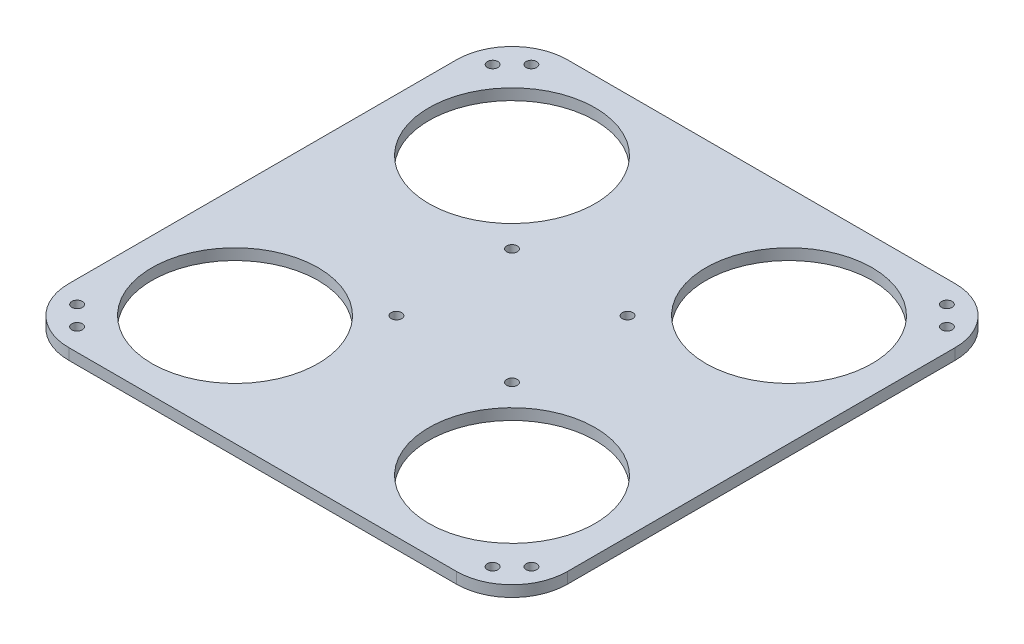
ISO-10303-21;
HEADER;
FILE_DESCRIPTION(('STEP AP214'),'2;1');
FILE_NAME('part.step','',(''),(''),'','','');
FILE_SCHEMA(('AUTOMOTIVE_DESIGN { 1 0 10303 214 1 1 1 1 }'));
ENDSEC;
DATA;
#1=APPLICATION_CONTEXT('core data for automotive mechanical design processes');
#2=APPLICATION_PROTOCOL_DEFINITION('international standard','automotive_design',2000,#1);
#3=PRODUCT_CONTEXT('',#1,'mechanical');
#4=PRODUCT('Part','Part','',(#3));
#5=PRODUCT_RELATED_PRODUCT_CATEGORY('part','',(#4));
#6=PRODUCT_DEFINITION_FORMATION('','',#4);
#7=PRODUCT_DEFINITION_CONTEXT('part definition',#1,'design');
#8=PRODUCT_DEFINITION('design','',#6,#7);
#9=PRODUCT_DEFINITION_SHAPE('','',#8);
#10=(LENGTH_UNIT() NAMED_UNIT(*) SI_UNIT(.MILLI.,.METRE.));
#11=(NAMED_UNIT(*) PLANE_ANGLE_UNIT() SI_UNIT($,.RADIAN.));
#12=(NAMED_UNIT(*) SI_UNIT($,.STERADIAN.) SOLID_ANGLE_UNIT());
#13=UNCERTAINTY_MEASURE_WITH_UNIT(LENGTH_MEASURE(1.E-05),#10,'distance_accuracy_value','');
#14=(GEOMETRIC_REPRESENTATION_CONTEXT(3) GLOBAL_UNCERTAINTY_ASSIGNED_CONTEXT((#13)) GLOBAL_UNIT_ASSIGNED_CONTEXT((#10,
#11,#12)) REPRESENTATION_CONTEXT('',''));
#15=CARTESIAN_POINT('',(0.,0.,0.));
#16=DIRECTION('',(0.,0.,1.));
#17=DIRECTION('',(1.,0.,0.));
#18=AXIS2_PLACEMENT_3D('',#15,#16,#17);
#19=CARTESIAN_POINT('',(0.,4.,0.));
#20=DIRECTION('',(0.,-1.,0.));
#21=DIRECTION('',(0.,0.,-1.));
#22=AXIS2_PLACEMENT_3D('',#19,#20,#21);
#23=PLANE('',#22);
#24=DIRECTION('',(0.,0.,1.));
#25=VECTOR('',#24,1.);
#26=CARTESIAN_POINT('',(-90.,4.,90.));
#27=LINE('',#26,#25);
#28=CARTESIAN_POINT('',(-90.,4.,-69.9999999999999));
#29=VERTEX_POINT('',#28);
#30=CARTESIAN_POINT('',(-90.,4.,70.));
#31=VERTEX_POINT('',#30);
#32=EDGE_CURVE('E200',#29,#31,#27,.T.);
#33=ORIENTED_EDGE('',*,*,#32,.T.);
#34=CARTESIAN_POINT('',(-70.,4.,70.));
#35=DIRECTION('',(0.,-1.,0.));
#36=DIRECTION('',(0.,0.,-1.));
#37=AXIS2_PLACEMENT_3D('',#34,#35,#36);
#38=CIRCLE('',#37,20.);
#39=CARTESIAN_POINT('',(-70.,4.,90.));
#40=VERTEX_POINT('',#39);
#41=EDGE_CURVE('E169',#31,#40,#38,.F.);
#42=ORIENTED_EDGE('',*,*,#41,.T.);
#43=DIRECTION('',(1.,0.,0.));
#44=VECTOR('',#43,1.);
#45=CARTESIAN_POINT('',(-90.,4.,90.));
#46=LINE('',#45,#44);
#47=CARTESIAN_POINT('',(69.9999999999999,4.,90.));
#48=VERTEX_POINT('',#47);
#49=EDGE_CURVE('E127',#40,#48,#46,.T.);
#50=ORIENTED_EDGE('',*,*,#49,.T.);
#51=CARTESIAN_POINT('',(70.,4.,70.));
#52=DIRECTION('',(0.,-1.,0.));
#53=DIRECTION('',(0.,0.,-1.));
#54=AXIS2_PLACEMENT_3D('',#51,#52,#53);
#55=CIRCLE('',#54,20.);
#56=CARTESIAN_POINT('',(90.,4.,70.));
#57=VERTEX_POINT('',#56);
#58=EDGE_CURVE('E161',#48,#57,#55,.F.);
#59=ORIENTED_EDGE('',*,*,#58,.T.);
#60=DIRECTION('',(0.,0.,-1.));
#61=VECTOR('',#60,1.);
#62=CARTESIAN_POINT('',(90.,4.,90.));
#63=LINE('',#62,#61);
#64=CARTESIAN_POINT('',(90.,4.,-69.9999999999999));
#65=VERTEX_POINT('',#64);
#66=EDGE_CURVE('E136',#57,#65,#63,.T.);
#67=ORIENTED_EDGE('',*,*,#66,.T.);
#68=CARTESIAN_POINT('',(70.,4.,-70.));
#69=DIRECTION('',(0.,-1.,0.));
#70=DIRECTION('',(0.,0.,-1.));
#71=AXIS2_PLACEMENT_3D('',#68,#69,#70);
#72=CIRCLE('',#71,20.);
#73=CARTESIAN_POINT('',(69.9999999999999,4.,-90.));
#74=VERTEX_POINT('',#73);
#75=EDGE_CURVE('E62',#65,#74,#72,.F.);
#76=ORIENTED_EDGE('',*,*,#75,.T.);
#77=DIRECTION('',(-1.,0.,0.));
#78=VECTOR('',#77,1.);
#79=CARTESIAN_POINT('',(-90.,4.,-90.));
#80=LINE('',#79,#78);
#81=CARTESIAN_POINT('',(-70.,4.,-90.));
#82=VERTEX_POINT('',#81);
#83=EDGE_CURVE('E141',#74,#82,#80,.T.);
#84=ORIENTED_EDGE('',*,*,#83,.T.);
#85=CARTESIAN_POINT('',(-70.,4.,-70.));
#86=DIRECTION('',(0.,-1.,0.));
#87=DIRECTION('',(0.,0.,-1.));
#88=AXIS2_PLACEMENT_3D('',#85,#86,#87);
#89=CIRCLE('',#88,20.);
#90=EDGE_CURVE('E166',#82,#29,#89,.F.);
#91=ORIENTED_EDGE('',*,*,#90,.T.);
#92=EDGE_LOOP('',(#33,#42,#50,#59,#67,#76,#84,#91));
#93=FACE_BOUND('',#92,.T.);
#94=CARTESIAN_POINT('',(-75.,4.,-82.));
#95=DIRECTION('',(0.,1.,0.));
#96=DIRECTION('',(0.,0.,1.));
#97=AXIS2_PLACEMENT_3D('',#94,#95,#96);
#98=CIRCLE('',#97,1.9);
#99=CARTESIAN_POINT('',(-75.,4.,-80.1));
#100=VERTEX_POINT('',#99);
#101=EDGE_CURVE('E190',#100,#100,#98,.T.);
#102=ORIENTED_EDGE('',*,*,#101,.F.);
#103=EDGE_LOOP('',(#102));
#104=FACE_BOUND('',#103,.T.);
#105=CARTESIAN_POINT('',(-82.,4.,-75.));
#106=DIRECTION('',(0.,1.,0.));
#107=DIRECTION('',(0.,0.,1.));
#108=AXIS2_PLACEMENT_3D('',#105,#106,#107);
#109=CIRCLE('',#108,1.9);
#110=CARTESIAN_POINT('',(-82.,4.,-73.1));
#111=VERTEX_POINT('',#110);
#112=EDGE_CURVE('E208',#111,#111,#109,.T.);
#113=ORIENTED_EDGE('',*,*,#112,.F.);
#114=EDGE_LOOP('',(#113));
#115=FACE_BOUND('',#114,.T.);
#116=CARTESIAN_POINT('',(82.,4.,-75.));
#117=DIRECTION('',(0.,1.,0.));
#118=DIRECTION('',(0.,0.,-1.));
#119=AXIS2_PLACEMENT_3D('',#116,#117,#118);
#120=CIRCLE('',#119,1.89999999999997);
#121=CARTESIAN_POINT('',(82.,4.,-76.9));
#122=VERTEX_POINT('',#121);
#123=EDGE_CURVE('E214',#122,#122,#120,.T.);
#124=ORIENTED_EDGE('',*,*,#123,.F.);
#125=EDGE_LOOP('',(#124));
#126=FACE_BOUND('',#125,.T.);
#127=CARTESIAN_POINT('',(75.,4.,-82.));
#128=DIRECTION('',(0.,1.,0.));
#129=DIRECTION('',(0.,0.,-1.));
#130=AXIS2_PLACEMENT_3D('',#127,#128,#129);
#131=CIRCLE('',#130,1.89999999999997);
#132=CARTESIAN_POINT('',(75.,4.,-83.9));
#133=VERTEX_POINT('',#132);
#134=EDGE_CURVE('E222',#133,#133,#131,.T.);
#135=ORIENTED_EDGE('',*,*,#134,.F.);
#136=EDGE_LOOP('',(#135));
#137=FACE_BOUND('',#136,.T.);
#138=CARTESIAN_POINT('',(75.,4.,82.));
#139=DIRECTION('',(0.,1.,0.));
#140=DIRECTION('',(0.,0.,1.));
#141=AXIS2_PLACEMENT_3D('',#138,#139,#140);
#142=CIRCLE('',#141,1.89999999999995);
#143=CARTESIAN_POINT('',(75.,4.,83.8999999999999));
#144=VERTEX_POINT('',#143);
#145=EDGE_CURVE('E230',#144,#144,#142,.T.);
#146=ORIENTED_EDGE('',*,*,#145,.F.);
#147=EDGE_LOOP('',(#146));
#148=FACE_BOUND('',#147,.T.);
#149=CARTESIAN_POINT('',(82.,4.,75.));
#150=DIRECTION('',(0.,1.,0.));
#151=DIRECTION('',(0.,0.,1.));
#152=AXIS2_PLACEMENT_3D('',#149,#150,#151);
#153=CIRCLE('',#152,1.89999999999996);
#154=CARTESIAN_POINT('',(82.,4.,76.8999999999999));
#155=VERTEX_POINT('',#154);
#156=EDGE_CURVE('E238',#155,#155,#153,.T.);
#157=ORIENTED_EDGE('',*,*,#156,.F.);
#158=EDGE_LOOP('',(#157));
#159=FACE_BOUND('',#158,.T.);
#160=CARTESIAN_POINT('',(-82.,4.,75.));
#161=DIRECTION('',(0.,1.,0.));
#162=DIRECTION('',(0.,0.,-1.));
#163=AXIS2_PLACEMENT_3D('',#160,#161,#162);
#164=CIRCLE('',#163,1.90000000000001);
#165=CARTESIAN_POINT('',(-82.,4.,73.1));
#166=VERTEX_POINT('',#165);
#167=EDGE_CURVE('E246',#166,#166,#164,.T.);
#168=ORIENTED_EDGE('',*,*,#167,.F.);
#169=EDGE_LOOP('',(#168));
#170=FACE_BOUND('',#169,.T.);
#171=CARTESIAN_POINT('',(-75.,4.,82.));
#172=DIRECTION('',(0.,1.,0.));
#173=DIRECTION('',(0.,0.,-1.));
#174=AXIS2_PLACEMENT_3D('',#171,#172,#173);
#175=CIRCLE('',#174,1.90000000000001);
#176=CARTESIAN_POINT('',(-75.,4.,80.1));
#177=VERTEX_POINT('',#176);
#178=EDGE_CURVE('E254',#177,#177,#175,.T.);
#179=ORIENTED_EDGE('',*,*,#178,.F.);
#180=EDGE_LOOP('',(#179));
#181=FACE_BOUND('',#180,.T.);
#182=CARTESIAN_POINT('',(20.8596500450031,4.,-20.8596500450032));
#183=DIRECTION('',(0.,1.,0.));
#184=DIRECTION('',(0.,0.,1.));
#185=AXIS2_PLACEMENT_3D('',#182,#183,#184);
#186=CIRCLE('',#185,1.9);
#187=CARTESIAN_POINT('',(20.8596500450031,4.,-18.9596500450032));
#188=VERTEX_POINT('',#187);
#189=EDGE_CURVE('E262',#188,#188,#186,.T.);
#190=ORIENTED_EDGE('',*,*,#189,.F.);
#191=EDGE_LOOP('',(#190));
#192=FACE_BOUND('',#191,.T.);
#193=CARTESIAN_POINT('',(-50.,4.,-50.));
#194=DIRECTION('',(0.,1.,0.));
#195=DIRECTION('',(0.,0.,1.));
#196=AXIS2_PLACEMENT_3D('',#193,#194,#195);
#197=CIRCLE('',#196,30.);
#198=CARTESIAN_POINT('',(-50.,4.,-20.));
#199=VERTEX_POINT('',#198);
#200=EDGE_CURVE('E270',#199,#199,#197,.T.);
#201=ORIENTED_EDGE('',*,*,#200,.F.);
#202=EDGE_LOOP('',(#201));
#203=FACE_BOUND('',#202,.T.);
#204=CARTESIAN_POINT('',(20.8596500450031,4.,20.8596500450032));
#205=DIRECTION('',(0.,1.,0.));
#206=DIRECTION('',(0.,0.,1.));
#207=AXIS2_PLACEMENT_3D('',#204,#205,#206);
#208=CIRCLE('',#207,1.9);
#209=CARTESIAN_POINT('',(20.8596500450031,4.,22.7596500450032));
#210=VERTEX_POINT('',#209);
#211=EDGE_CURVE('E278',#210,#210,#208,.T.);
#212=ORIENTED_EDGE('',*,*,#211,.F.);
#213=EDGE_LOOP('',(#212));
#214=FACE_BOUND('',#213,.T.);
#215=CARTESIAN_POINT('',(-20.8596500450033,4.,20.859650045003));
#216=DIRECTION('',(0.,1.,0.));
#217=DIRECTION('',(0.,0.,1.));
#218=AXIS2_PLACEMENT_3D('',#215,#216,#217);
#219=CIRCLE('',#218,1.9);
#220=CARTESIAN_POINT('',(-20.8596500450033,4.,22.759650045003));
#221=VERTEX_POINT('',#220);
#222=EDGE_CURVE('E286',#221,#221,#219,.T.);
#223=ORIENTED_EDGE('',*,*,#222,.F.);
#224=EDGE_LOOP('',(#223));
#225=FACE_BOUND('',#224,.T.);
#226=CARTESIAN_POINT('',(-20.859650045003,4.,-20.8596500450033));
#227=DIRECTION('',(0.,1.,0.));
#228=DIRECTION('',(0.,0.,1.));
#229=AXIS2_PLACEMENT_3D('',#226,#227,#228);
#230=CIRCLE('',#229,1.9);
#231=CARTESIAN_POINT('',(-20.859650045003,4.,-18.9596500450033));
#232=VERTEX_POINT('',#231);
#233=EDGE_CURVE('E294',#232,#232,#230,.T.);
#234=ORIENTED_EDGE('',*,*,#233,.F.);
#235=EDGE_LOOP('',(#234));
#236=FACE_BOUND('',#235,.T.);
#237=CARTESIAN_POINT('',(50.,4.,-50.));
#238=DIRECTION('',(0.,1.,0.));
#239=DIRECTION('',(0.,0.,-1.));
#240=AXIS2_PLACEMENT_3D('',#237,#238,#239);
#241=CIRCLE('',#240,30.);
#242=CARTESIAN_POINT('',(50.,4.,-80.));
#243=VERTEX_POINT('',#242);
#244=EDGE_CURVE('E302',#243,#243,#241,.T.);
#245=ORIENTED_EDGE('',*,*,#244,.F.);
#246=EDGE_LOOP('',(#245));
#247=FACE_BOUND('',#246,.T.);
#248=CARTESIAN_POINT('',(-50.,4.,50.));
#249=DIRECTION('',(0.,1.,0.));
#250=DIRECTION('',(0.,0.,-1.));
#251=AXIS2_PLACEMENT_3D('',#248,#249,#250);
#252=CIRCLE('',#251,30.);
#253=CARTESIAN_POINT('',(-50.,4.,20.));
#254=VERTEX_POINT('',#253);
#255=EDGE_CURVE('E310',#254,#254,#252,.T.);
#256=ORIENTED_EDGE('',*,*,#255,.F.);
#257=EDGE_LOOP('',(#256));
#258=FACE_BOUND('',#257,.T.);
#259=CARTESIAN_POINT('',(50.,4.,50.));
#260=DIRECTION('',(0.,1.,0.));
#261=DIRECTION('',(0.,0.,1.));
#262=AXIS2_PLACEMENT_3D('',#259,#260,#261);
#263=CIRCLE('',#262,30.);
#264=CARTESIAN_POINT('',(50.,4.,80.));
#265=VERTEX_POINT('',#264);
#266=EDGE_CURVE('E318',#265,#265,#263,.T.);
#267=ORIENTED_EDGE('',*,*,#266,.F.);
#268=EDGE_LOOP('',(#267));
#269=FACE_BOUND('',#268,.T.);
#270=ADVANCED_FACE('F39',(#93,#104,#115,#126,#137,#148,#159,#170,#181,#192,#203,#214,#225,#236,
#247,#258,#269),#23,.F.);
#271=CARTESIAN_POINT('',(0.,0.,0.));
#272=DIRECTION('',(0.,-1.,0.));
#273=DIRECTION('',(0.,0.,-1.));
#274=AXIS2_PLACEMENT_3D('',#271,#272,#273);
#275=PLANE('',#274);
#276=CARTESIAN_POINT('',(-50.,0.,50.));
#277=DIRECTION('',(0.,1.,0.));
#278=DIRECTION('',(0.,0.,-1.));
#279=AXIS2_PLACEMENT_3D('',#276,#277,#278);
#280=CIRCLE('',#279,30.);
#281=CARTESIAN_POINT('',(-50.,0.,20.));
#282=VERTEX_POINT('',#281);
#283=EDGE_CURVE('E314',#282,#282,#280,.T.);
#284=ORIENTED_EDGE('',*,*,#283,.T.);
#285=EDGE_LOOP('',(#284));
#286=FACE_BOUND('',#285,.T.);
#287=CARTESIAN_POINT('',(-20.859650045003,0.,-20.8596500450033));
#288=DIRECTION('',(0.,1.,0.));
#289=DIRECTION('',(0.,0.,1.));
#290=AXIS2_PLACEMENT_3D('',#287,#288,#289);
#291=CIRCLE('',#290,1.9);
#292=CARTESIAN_POINT('',(-20.859650045003,0.,-18.9596500450033));
#293=VERTEX_POINT('',#292);
#294=EDGE_CURVE('E298',#293,#293,#291,.T.);
#295=ORIENTED_EDGE('',*,*,#294,.T.);
#296=EDGE_LOOP('',(#295));
#297=FACE_BOUND('',#296,.T.);
#298=CARTESIAN_POINT('',(20.8596500450031,0.,20.8596500450032));
#299=DIRECTION('',(0.,1.,0.));
#300=DIRECTION('',(0.,0.,1.));
#301=AXIS2_PLACEMENT_3D('',#298,#299,#300);
#302=CIRCLE('',#301,1.9);
#303=CARTESIAN_POINT('',(20.8596500450031,0.,22.7596500450032));
#304=VERTEX_POINT('',#303);
#305=EDGE_CURVE('E282',#304,#304,#302,.T.);
#306=ORIENTED_EDGE('',*,*,#305,.T.);
#307=EDGE_LOOP('',(#306));
#308=FACE_BOUND('',#307,.T.);
#309=CARTESIAN_POINT('',(20.8596500450031,0.,-20.8596500450032));
#310=DIRECTION('',(0.,1.,0.));
#311=DIRECTION('',(0.,0.,1.));
#312=AXIS2_PLACEMENT_3D('',#309,#310,#311);
#313=CIRCLE('',#312,1.9);
#314=CARTESIAN_POINT('',(20.8596500450031,0.,-18.9596500450032));
#315=VERTEX_POINT('',#314);
#316=EDGE_CURVE('E266',#315,#315,#313,.T.);
#317=ORIENTED_EDGE('',*,*,#316,.T.);
#318=EDGE_LOOP('',(#317));
#319=FACE_BOUND('',#318,.T.);
#320=CARTESIAN_POINT('',(-82.,0.,75.));
#321=DIRECTION('',(0.,1.,0.));
#322=DIRECTION('',(0.,0.,-1.));
#323=AXIS2_PLACEMENT_3D('',#320,#321,#322);
#324=CIRCLE('',#323,1.90000000000001);
#325=CARTESIAN_POINT('',(-82.,0.,73.1));
#326=VERTEX_POINT('',#325);
#327=EDGE_CURVE('E250',#326,#326,#324,.T.);
#328=ORIENTED_EDGE('',*,*,#327,.T.);
#329=EDGE_LOOP('',(#328));
#330=FACE_BOUND('',#329,.T.);
#331=CARTESIAN_POINT('',(75.,0.,82.));
#332=DIRECTION('',(0.,1.,0.));
#333=DIRECTION('',(0.,0.,1.));
#334=AXIS2_PLACEMENT_3D('',#331,#332,#333);
#335=CIRCLE('',#334,1.89999999999995);
#336=CARTESIAN_POINT('',(75.,0.,83.8999999999999));
#337=VERTEX_POINT('',#336);
#338=EDGE_CURVE('E234',#337,#337,#335,.T.);
#339=ORIENTED_EDGE('',*,*,#338,.T.);
#340=EDGE_LOOP('',(#339));
#341=FACE_BOUND('',#340,.T.);
#342=CARTESIAN_POINT('',(82.,0.,-75.));
#343=DIRECTION('',(0.,1.,0.));
#344=DIRECTION('',(0.,0.,-1.));
#345=AXIS2_PLACEMENT_3D('',#342,#343,#344);
#346=CIRCLE('',#345,1.89999999999997);
#347=CARTESIAN_POINT('',(82.,0.,-76.9));
#348=VERTEX_POINT('',#347);
#349=EDGE_CURVE('E218',#348,#348,#346,.T.);
#350=ORIENTED_EDGE('',*,*,#349,.T.);
#351=EDGE_LOOP('',(#350));
#352=FACE_BOUND('',#351,.T.);
#353=CARTESIAN_POINT('',(-75.,0.,-82.));
#354=DIRECTION('',(0.,1.,0.));
#355=DIRECTION('',(0.,0.,1.));
#356=AXIS2_PLACEMENT_3D('',#353,#354,#355);
#357=CIRCLE('',#356,1.9);
#358=CARTESIAN_POINT('',(-75.,0.,-80.1));
#359=VERTEX_POINT('',#358);
#360=EDGE_CURVE('E195',#359,#359,#357,.T.);
#361=ORIENTED_EDGE('',*,*,#360,.T.);
#362=EDGE_LOOP('',(#361));
#363=FACE_BOUND('',#362,.T.);
#364=DIRECTION('',(1.,0.,0.));
#365=VECTOR('',#364,1.);
#366=CARTESIAN_POINT('',(-90.,0.,90.));
#367=LINE('',#366,#365);
#368=CARTESIAN_POINT('',(-70.,0.,90.));
#369=VERTEX_POINT('',#368);
#370=CARTESIAN_POINT('',(69.9999999999999,0.,90.));
#371=VERTEX_POINT('',#370);
#372=EDGE_CURVE('E124',#369,#371,#367,.T.);
#373=ORIENTED_EDGE('',*,*,#372,.F.);
#374=CARTESIAN_POINT('',(-70.,0.,70.));
#375=DIRECTION('',(0.,-1.,0.));
#376=DIRECTION('',(0.,0.,-1.));
#377=AXIS2_PLACEMENT_3D('',#374,#375,#376);
#378=CIRCLE('',#377,20.);
#379=CARTESIAN_POINT('',(-90.,0.,70.));
#380=VERTEX_POINT('',#379);
#381=EDGE_CURVE('E106',#369,#380,#378,.T.);
#382=ORIENTED_EDGE('',*,*,#381,.T.);
#383=DIRECTION('',(0.,0.,1.));
#384=VECTOR('',#383,1.);
#385=CARTESIAN_POINT('',(-90.,0.,90.));
#386=LINE('',#385,#384);
#387=CARTESIAN_POINT('',(-90.,0.,-69.9999999999999));
#388=VERTEX_POINT('',#387);
#389=EDGE_CURVE('E137',#388,#380,#386,.T.);
#390=ORIENTED_EDGE('',*,*,#389,.F.);
#391=CARTESIAN_POINT('',(-70.,0.,-70.));
#392=DIRECTION('',(0.,-1.,0.));
#393=DIRECTION('',(0.,0.,-1.));
#394=AXIS2_PLACEMENT_3D('',#391,#392,#393);
#395=CIRCLE('',#394,20.);
#396=CARTESIAN_POINT('',(-70.,0.,-90.));
#397=VERTEX_POINT('',#396);
#398=EDGE_CURVE('E118',#388,#397,#395,.T.);
#399=ORIENTED_EDGE('',*,*,#398,.T.);
#400=DIRECTION('',(-1.,0.,0.));
#401=VECTOR('',#400,1.);
#402=CARTESIAN_POINT('',(-90.,0.,-90.));
#403=LINE('',#402,#401);
#404=CARTESIAN_POINT('',(69.9999999999999,0.,-90.));
#405=VERTEX_POINT('',#404);
#406=EDGE_CURVE('E143',#405,#397,#403,.T.);
#407=ORIENTED_EDGE('',*,*,#406,.F.);
#408=CARTESIAN_POINT('',(70.,0.,-70.));
#409=DIRECTION('',(0.,-1.,0.));
#410=DIRECTION('',(0.,0.,-1.));
#411=AXIS2_PLACEMENT_3D('',#408,#409,#410);
#412=CIRCLE('',#411,20.);
#413=CARTESIAN_POINT('',(90.,0.,-69.9999999999999));
#414=VERTEX_POINT('',#413);
#415=EDGE_CURVE('E151',#405,#414,#412,.T.);
#416=ORIENTED_EDGE('',*,*,#415,.T.);
#417=DIRECTION('',(0.,0.,-1.));
#418=VECTOR('',#417,1.);
#419=CARTESIAN_POINT('',(90.,0.,90.));
#420=LINE('',#419,#418);
#421=CARTESIAN_POINT('',(90.,0.,70.));
#422=VERTEX_POINT('',#421);
#423=EDGE_CURVE('E184',#422,#414,#420,.T.);
#424=ORIENTED_EDGE('',*,*,#423,.F.);
#425=CARTESIAN_POINT('',(70.,0.,70.));
#426=DIRECTION('',(0.,-1.,0.));
#427=DIRECTION('',(0.,0.,-1.));
#428=AXIS2_PLACEMENT_3D('',#425,#426,#427);
#429=CIRCLE('',#428,20.);
#430=EDGE_CURVE('E129',#422,#371,#429,.T.);
#431=ORIENTED_EDGE('',*,*,#430,.T.);
#432=EDGE_LOOP('',(#373,#382,#390,#399,#407,#416,#424,#431));
#433=FACE_BOUND('',#432,.T.);
#434=CARTESIAN_POINT('',(-82.,0.,-75.));
#435=DIRECTION('',(0.,1.,0.));
#436=DIRECTION('',(0.,0.,1.));
#437=AXIS2_PLACEMENT_3D('',#434,#435,#436);
#438=CIRCLE('',#437,1.9);
#439=CARTESIAN_POINT('',(-82.,0.,-73.1));
#440=VERTEX_POINT('',#439);
#441=EDGE_CURVE('E210',#440,#440,#438,.T.);
#442=ORIENTED_EDGE('',*,*,#441,.T.);
#443=EDGE_LOOP('',(#442));
#444=FACE_BOUND('',#443,.T.);
#445=CARTESIAN_POINT('',(75.,0.,-82.));
#446=DIRECTION('',(0.,1.,0.));
#447=DIRECTION('',(0.,0.,-1.));
#448=AXIS2_PLACEMENT_3D('',#445,#446,#447);
#449=CIRCLE('',#448,1.89999999999997);
#450=CARTESIAN_POINT('',(75.,0.,-83.9));
#451=VERTEX_POINT('',#450);
#452=EDGE_CURVE('E226',#451,#451,#449,.T.);
#453=ORIENTED_EDGE('',*,*,#452,.T.);
#454=EDGE_LOOP('',(#453));
#455=FACE_BOUND('',#454,.T.);
#456=CARTESIAN_POINT('',(82.,0.,75.));
#457=DIRECTION('',(0.,1.,0.));
#458=DIRECTION('',(0.,0.,1.));
#459=AXIS2_PLACEMENT_3D('',#456,#457,#458);
#460=CIRCLE('',#459,1.89999999999996);
#461=CARTESIAN_POINT('',(82.,0.,76.8999999999999));
#462=VERTEX_POINT('',#461);
#463=EDGE_CURVE('E242',#462,#462,#460,.T.);
#464=ORIENTED_EDGE('',*,*,#463,.T.);
#465=EDGE_LOOP('',(#464));
#466=FACE_BOUND('',#465,.T.);
#467=CARTESIAN_POINT('',(-75.,0.,82.));
#468=DIRECTION('',(0.,1.,0.));
#469=DIRECTION('',(0.,0.,-1.));
#470=AXIS2_PLACEMENT_3D('',#467,#468,#469);
#471=CIRCLE('',#470,1.90000000000001);
#472=CARTESIAN_POINT('',(-75.,0.,80.1));
#473=VERTEX_POINT('',#472);
#474=EDGE_CURVE('E258',#473,#473,#471,.T.);
#475=ORIENTED_EDGE('',*,*,#474,.T.);
#476=EDGE_LOOP('',(#475));
#477=FACE_BOUND('',#476,.T.);
#478=CARTESIAN_POINT('',(-50.,0.,-50.));
#479=DIRECTION('',(0.,1.,0.));
#480=DIRECTION('',(0.,0.,1.));
#481=AXIS2_PLACEMENT_3D('',#478,#479,#480);
#482=CIRCLE('',#481,30.);
#483=CARTESIAN_POINT('',(-50.,0.,-20.));
#484=VERTEX_POINT('',#483);
#485=EDGE_CURVE('E274',#484,#484,#482,.T.);
#486=ORIENTED_EDGE('',*,*,#485,.T.);
#487=EDGE_LOOP('',(#486));
#488=FACE_BOUND('',#487,.T.);
#489=CARTESIAN_POINT('',(-20.8596500450033,0.,20.859650045003));
#490=DIRECTION('',(0.,1.,0.));
#491=DIRECTION('',(0.,0.,1.));
#492=AXIS2_PLACEMENT_3D('',#489,#490,#491);
#493=CIRCLE('',#492,1.9);
#494=CARTESIAN_POINT('',(-20.8596500450033,0.,22.759650045003));
#495=VERTEX_POINT('',#494);
#496=EDGE_CURVE('E290',#495,#495,#493,.T.);
#497=ORIENTED_EDGE('',*,*,#496,.T.);
#498=EDGE_LOOP('',(#497));
#499=FACE_BOUND('',#498,.T.);
#500=CARTESIAN_POINT('',(50.,0.,-50.));
#501=DIRECTION('',(0.,1.,0.));
#502=DIRECTION('',(0.,0.,-1.));
#503=AXIS2_PLACEMENT_3D('',#500,#501,#502);
#504=CIRCLE('',#503,30.);
#505=CARTESIAN_POINT('',(50.,0.,-80.));
#506=VERTEX_POINT('',#505);
#507=EDGE_CURVE('E306',#506,#506,#504,.T.);
#508=ORIENTED_EDGE('',*,*,#507,.T.);
#509=EDGE_LOOP('',(#508));
#510=FACE_BOUND('',#509,.T.);
#511=CARTESIAN_POINT('',(50.,0.,50.));
#512=DIRECTION('',(0.,1.,0.));
#513=DIRECTION('',(0.,0.,1.));
#514=AXIS2_PLACEMENT_3D('',#511,#512,#513);
#515=CIRCLE('',#514,30.);
#516=CARTESIAN_POINT('',(50.,0.,80.));
#517=VERTEX_POINT('',#516);
#518=EDGE_CURVE('E322',#517,#517,#515,.T.);
#519=ORIENTED_EDGE('',*,*,#518,.T.);
#520=EDGE_LOOP('',(#519));
#521=FACE_BOUND('',#520,.T.);
#522=ADVANCED_FACE('F132',(#286,#297,#308,#319,#330,#341,#352,#363,#433,#444,#455,#466,#477,
#488,#499,#510,#521),#275,.T.);
#523=CARTESIAN_POINT('',(90.,4.,90.));
#524=DIRECTION('',(-1.,0.,0.));
#525=DIRECTION('',(0.,0.,1.));
#526=AXIS2_PLACEMENT_3D('',#523,#524,#525);
#527=PLANE('',#526);
#528=ORIENTED_EDGE('',*,*,#423,.T.);
#529=DIRECTION('',(0.,-1.,0.));
#530=VECTOR('',#529,1.);
#531=CARTESIAN_POINT('',(90.,4.,-70.));
#532=LINE('',#531,#530);
#533=EDGE_CURVE('E11',#414,#65,#532,.F.);
#534=ORIENTED_EDGE('',*,*,#533,.T.);
#535=ORIENTED_EDGE('',*,*,#66,.F.);
#536=DIRECTION('',(0.,-1.,0.));
#537=VECTOR('',#536,1.);
#538=CARTESIAN_POINT('',(90.,4.,70.));
#539=LINE('',#538,#537);
#540=EDGE_CURVE('E48',#57,#422,#539,.T.);
#541=ORIENTED_EDGE('',*,*,#540,.T.);
#542=EDGE_LOOP('',(#528,#534,#535,#541));
#543=FACE_BOUND('',#542,.T.);
#544=ADVANCED_FACE('F183',(#543),#527,.F.);
#545=CARTESIAN_POINT('',(-90.,4.,-90.));
#546=DIRECTION('',(0.,0.,1.));
#547=DIRECTION('',(1.,0.,0.));
#548=AXIS2_PLACEMENT_3D('',#545,#546,#547);
#549=PLANE('',#548);
#550=ORIENTED_EDGE('',*,*,#406,.T.);
#551=DIRECTION('',(0.,-1.,0.));
#552=VECTOR('',#551,1.);
#553=CARTESIAN_POINT('',(-70.,4.,-90.));
#554=LINE('',#553,#552);
#555=EDGE_CURVE('E55',#397,#82,#554,.F.);
#556=ORIENTED_EDGE('',*,*,#555,.T.);
#557=ORIENTED_EDGE('',*,*,#83,.F.);
#558=DIRECTION('',(0.,-1.,0.));
#559=VECTOR('',#558,1.);
#560=CARTESIAN_POINT('',(70.,4.,-90.));
#561=LINE('',#560,#559);
#562=EDGE_CURVE('E172',#74,#405,#561,.T.);
#563=ORIENTED_EDGE('',*,*,#562,.T.);
#564=EDGE_LOOP('',(#550,#556,#557,#563));
#565=FACE_BOUND('',#564,.T.);
#566=ADVANCED_FACE('F350',(#565),#549,.F.);
#567=CARTESIAN_POINT('',(-90.,4.,90.));
#568=DIRECTION('',(1.,0.,0.));
#569=DIRECTION('',(0.,0.,-1.));
#570=AXIS2_PLACEMENT_3D('',#567,#568,#569);
#571=PLANE('',#570);
#572=ORIENTED_EDGE('',*,*,#389,.T.);
#573=DIRECTION('',(0.,-1.,0.));
#574=VECTOR('',#573,1.);
#575=CARTESIAN_POINT('',(-90.,4.,70.));
#576=LINE('',#575,#574);
#577=EDGE_CURVE('E111',#380,#31,#576,.F.);
#578=ORIENTED_EDGE('',*,*,#577,.T.);
#579=ORIENTED_EDGE('',*,*,#32,.F.);
#580=DIRECTION('',(0.,-1.,0.));
#581=VECTOR('',#580,1.);
#582=CARTESIAN_POINT('',(-90.,4.,-70.));
#583=LINE('',#582,#581);
#584=EDGE_CURVE('E117',#29,#388,#583,.T.);
#585=ORIENTED_EDGE('',*,*,#584,.T.);
#586=EDGE_LOOP('',(#572,#578,#579,#585));
#587=FACE_BOUND('',#586,.T.);
#588=ADVANCED_FACE('F347',(#587),#571,.F.);
#589=CARTESIAN_POINT('',(-90.,4.,90.));
#590=DIRECTION('',(0.,0.,-1.));
#591=DIRECTION('',(-1.,0.,0.));
#592=AXIS2_PLACEMENT_3D('',#589,#590,#591);
#593=PLANE('',#592);
#594=ORIENTED_EDGE('',*,*,#49,.F.);
#595=DIRECTION('',(0.,-1.,0.));
#596=VECTOR('',#595,1.);
#597=CARTESIAN_POINT('',(-70.,4.,90.));
#598=LINE('',#597,#596);
#599=EDGE_CURVE('E110',#40,#369,#598,.T.);
#600=ORIENTED_EDGE('',*,*,#599,.T.);
#601=ORIENTED_EDGE('',*,*,#372,.T.);
#602=DIRECTION('',(0.,-1.,0.));
#603=VECTOR('',#602,1.);
#604=CARTESIAN_POINT('',(70.,4.,90.));
#605=LINE('',#604,#603);
#606=EDGE_CURVE('E130',#371,#48,#605,.F.);
#607=ORIENTED_EDGE('',*,*,#606,.T.);
#608=EDGE_LOOP('',(#594,#600,#601,#607));
#609=FACE_BOUND('',#608,.T.);
#610=ADVANCED_FACE('F123',(#609),#593,.F.);
#611=CARTESIAN_POINT('',(-75.,4.,-82.));
#612=DIRECTION('',(0.,-1.,0.));
#613=DIRECTION('',(0.,0.,-1.));
#614=AXIS2_PLACEMENT_3D('',#611,#612,#613);
#615=CYLINDRICAL_SURFACE('',#614,1.9);
#616=ORIENTED_EDGE('',*,*,#101,.T.);
#617=EDGE_LOOP('',(#616));
#618=FACE_BOUND('',#617,.T.);
#619=ORIENTED_EDGE('',*,*,#360,.F.);
#620=EDGE_LOOP('',(#619));
#621=FACE_BOUND('',#620,.T.);
#622=ADVANCED_FACE('F342',(#618,#621),#615,.F.);
#623=CARTESIAN_POINT('',(-82.,4.,-75.));
#624=DIRECTION('',(0.,-1.,0.));
#625=DIRECTION('',(0.,0.,-1.));
#626=AXIS2_PLACEMENT_3D('',#623,#624,#625);
#627=CYLINDRICAL_SURFACE('',#626,1.9);
#628=ORIENTED_EDGE('',*,*,#112,.T.);
#629=EDGE_LOOP('',(#628));
#630=FACE_BOUND('',#629,.T.);
#631=ORIENTED_EDGE('',*,*,#441,.F.);
#632=EDGE_LOOP('',(#631));
#633=FACE_BOUND('',#632,.T.);
#634=ADVANCED_FACE('F563',(#630,#633),#627,.F.);
#635=CARTESIAN_POINT('',(82.,4.,-75.));
#636=DIRECTION('',(0.,-1.,0.));
#637=DIRECTION('',(0.,0.,-1.));
#638=AXIS2_PLACEMENT_3D('',#635,#636,#637);
#639=CYLINDRICAL_SURFACE('',#638,1.89999999999997);
#640=ORIENTED_EDGE('',*,*,#123,.T.);
#641=EDGE_LOOP('',(#640));
#642=FACE_BOUND('',#641,.T.);
#643=ORIENTED_EDGE('',*,*,#349,.F.);
#644=EDGE_LOOP('',(#643));
#645=FACE_BOUND('',#644,.T.);
#646=ADVANCED_FACE('F553',(#642,#645),#639,.F.);
#647=CARTESIAN_POINT('',(75.,4.,-82.));
#648=DIRECTION('',(0.,-1.,0.));
#649=DIRECTION('',(0.,0.,-1.));
#650=AXIS2_PLACEMENT_3D('',#647,#648,#649);
#651=CYLINDRICAL_SURFACE('',#650,1.89999999999997);
#652=ORIENTED_EDGE('',*,*,#134,.T.);
#653=EDGE_LOOP('',(#652));
#654=FACE_BOUND('',#653,.T.);
#655=ORIENTED_EDGE('',*,*,#452,.F.);
#656=EDGE_LOOP('',(#655));
#657=FACE_BOUND('',#656,.T.);
#658=ADVANCED_FACE('F543',(#654,#657),#651,.F.);
#659=CARTESIAN_POINT('',(75.,4.,82.));
#660=DIRECTION('',(0.,-1.,0.));
#661=DIRECTION('',(0.,0.,-1.));
#662=AXIS2_PLACEMENT_3D('',#659,#660,#661);
#663=CYLINDRICAL_SURFACE('',#662,1.89999999999995);
#664=ORIENTED_EDGE('',*,*,#145,.T.);
#665=EDGE_LOOP('',(#664));
#666=FACE_BOUND('',#665,.T.);
#667=ORIENTED_EDGE('',*,*,#338,.F.);
#668=EDGE_LOOP('',(#667));
#669=FACE_BOUND('',#668,.T.);
#670=ADVANCED_FACE('F533',(#666,#669),#663,.F.);
#671=CARTESIAN_POINT('',(82.,4.,75.));
#672=DIRECTION('',(0.,-1.,0.));
#673=DIRECTION('',(0.,0.,-1.));
#674=AXIS2_PLACEMENT_3D('',#671,#672,#673);
#675=CYLINDRICAL_SURFACE('',#674,1.89999999999996);
#676=ORIENTED_EDGE('',*,*,#156,.T.);
#677=EDGE_LOOP('',(#676));
#678=FACE_BOUND('',#677,.T.);
#679=ORIENTED_EDGE('',*,*,#463,.F.);
#680=EDGE_LOOP('',(#679));
#681=FACE_BOUND('',#680,.T.);
#682=ADVANCED_FACE('F523',(#678,#681),#675,.F.);
#683=CARTESIAN_POINT('',(-82.,4.,75.));
#684=DIRECTION('',(0.,-1.,0.));
#685=DIRECTION('',(0.,0.,-1.));
#686=AXIS2_PLACEMENT_3D('',#683,#684,#685);
#687=CYLINDRICAL_SURFACE('',#686,1.90000000000001);
#688=ORIENTED_EDGE('',*,*,#167,.T.);
#689=EDGE_LOOP('',(#688));
#690=FACE_BOUND('',#689,.T.);
#691=ORIENTED_EDGE('',*,*,#327,.F.);
#692=EDGE_LOOP('',(#691));
#693=FACE_BOUND('',#692,.T.);
#694=ADVANCED_FACE('F513',(#690,#693),#687,.F.);
#695=CARTESIAN_POINT('',(-75.,4.,82.));
#696=DIRECTION('',(0.,-1.,0.));
#697=DIRECTION('',(0.,0.,-1.));
#698=AXIS2_PLACEMENT_3D('',#695,#696,#697);
#699=CYLINDRICAL_SURFACE('',#698,1.90000000000001);
#700=ORIENTED_EDGE('',*,*,#178,.T.);
#701=EDGE_LOOP('',(#700));
#702=FACE_BOUND('',#701,.T.);
#703=ORIENTED_EDGE('',*,*,#474,.F.);
#704=EDGE_LOOP('',(#703));
#705=FACE_BOUND('',#704,.T.);
#706=ADVANCED_FACE('F503',(#702,#705),#699,.F.);
#707=CARTESIAN_POINT('',(20.8596500450031,4.,-20.8596500450032));
#708=DIRECTION('',(0.,-1.,0.));
#709=DIRECTION('',(0.,0.,-1.));
#710=AXIS2_PLACEMENT_3D('',#707,#708,#709);
#711=CYLINDRICAL_SURFACE('',#710,1.9);
#712=ORIENTED_EDGE('',*,*,#189,.T.);
#713=EDGE_LOOP('',(#712));
#714=FACE_BOUND('',#713,.T.);
#715=ORIENTED_EDGE('',*,*,#316,.F.);
#716=EDGE_LOOP('',(#715));
#717=FACE_BOUND('',#716,.T.);
#718=ADVANCED_FACE('F493',(#714,#717),#711,.F.);
#719=CARTESIAN_POINT('',(-50.,4.,-50.));
#720=DIRECTION('',(0.,-1.,0.));
#721=DIRECTION('',(0.,0.,-1.));
#722=AXIS2_PLACEMENT_3D('',#719,#720,#721);
#723=CYLINDRICAL_SURFACE('',#722,30.);
#724=ORIENTED_EDGE('',*,*,#200,.T.);
#725=EDGE_LOOP('',(#724));
#726=FACE_BOUND('',#725,.T.);
#727=ORIENTED_EDGE('',*,*,#485,.F.);
#728=EDGE_LOOP('',(#727));
#729=FACE_BOUND('',#728,.T.);
#730=ADVANCED_FACE('F483',(#726,#729),#723,.F.);
#731=CARTESIAN_POINT('',(20.8596500450031,4.,20.8596500450032));
#732=DIRECTION('',(0.,-1.,0.));
#733=DIRECTION('',(0.,0.,-1.));
#734=AXIS2_PLACEMENT_3D('',#731,#732,#733);
#735=CYLINDRICAL_SURFACE('',#734,1.9);
#736=ORIENTED_EDGE('',*,*,#211,.T.);
#737=EDGE_LOOP('',(#736));
#738=FACE_BOUND('',#737,.T.);
#739=ORIENTED_EDGE('',*,*,#305,.F.);
#740=EDGE_LOOP('',(#739));
#741=FACE_BOUND('',#740,.T.);
#742=ADVANCED_FACE('F473',(#738,#741),#735,.F.);
#743=CARTESIAN_POINT('',(-20.8596500450033,4.,20.859650045003));
#744=DIRECTION('',(0.,-1.,0.));
#745=DIRECTION('',(0.,0.,-1.));
#746=AXIS2_PLACEMENT_3D('',#743,#744,#745);
#747=CYLINDRICAL_SURFACE('',#746,1.9);
#748=ORIENTED_EDGE('',*,*,#222,.T.);
#749=EDGE_LOOP('',(#748));
#750=FACE_BOUND('',#749,.T.);
#751=ORIENTED_EDGE('',*,*,#496,.F.);
#752=EDGE_LOOP('',(#751));
#753=FACE_BOUND('',#752,.T.);
#754=ADVANCED_FACE('F463',(#750,#753),#747,.F.);
#755=CARTESIAN_POINT('',(-20.859650045003,4.,-20.8596500450033));
#756=DIRECTION('',(0.,-1.,0.));
#757=DIRECTION('',(0.,0.,-1.));
#758=AXIS2_PLACEMENT_3D('',#755,#756,#757);
#759=CYLINDRICAL_SURFACE('',#758,1.9);
#760=ORIENTED_EDGE('',*,*,#233,.T.);
#761=EDGE_LOOP('',(#760));
#762=FACE_BOUND('',#761,.T.);
#763=ORIENTED_EDGE('',*,*,#294,.F.);
#764=EDGE_LOOP('',(#763));
#765=FACE_BOUND('',#764,.T.);
#766=ADVANCED_FACE('F453',(#762,#765),#759,.F.);
#767=CARTESIAN_POINT('',(50.,4.,-50.));
#768=DIRECTION('',(0.,-1.,0.));
#769=DIRECTION('',(0.,0.,-1.));
#770=AXIS2_PLACEMENT_3D('',#767,#768,#769);
#771=CYLINDRICAL_SURFACE('',#770,30.);
#772=ORIENTED_EDGE('',*,*,#244,.T.);
#773=EDGE_LOOP('',(#772));
#774=FACE_BOUND('',#773,.T.);
#775=ORIENTED_EDGE('',*,*,#507,.F.);
#776=EDGE_LOOP('',(#775));
#777=FACE_BOUND('',#776,.T.);
#778=ADVANCED_FACE('F443',(#774,#777),#771,.F.);
#779=CARTESIAN_POINT('',(-50.,4.,50.));
#780=DIRECTION('',(0.,-1.,0.));
#781=DIRECTION('',(0.,0.,-1.));
#782=AXIS2_PLACEMENT_3D('',#779,#780,#781);
#783=CYLINDRICAL_SURFACE('',#782,30.);
#784=ORIENTED_EDGE('',*,*,#255,.T.);
#785=EDGE_LOOP('',(#784));
#786=FACE_BOUND('',#785,.T.);
#787=ORIENTED_EDGE('',*,*,#283,.F.);
#788=EDGE_LOOP('',(#787));
#789=FACE_BOUND('',#788,.T.);
#790=ADVANCED_FACE('F434',(#786,#789),#783,.F.);
#791=CARTESIAN_POINT('',(50.,4.,50.));
#792=DIRECTION('',(0.,-1.,0.));
#793=DIRECTION('',(0.,0.,-1.));
#794=AXIS2_PLACEMENT_3D('',#791,#792,#793);
#795=CYLINDRICAL_SURFACE('',#794,30.);
#796=ORIENTED_EDGE('',*,*,#266,.T.);
#797=EDGE_LOOP('',(#796));
#798=FACE_BOUND('',#797,.T.);
#799=ORIENTED_EDGE('',*,*,#518,.F.);
#800=EDGE_LOOP('',(#799));
#801=FACE_BOUND('',#800,.T.);
#802=ADVANCED_FACE('F330',(#798,#801),#795,.F.);
#803=CARTESIAN_POINT('',(-70.,4.,70.));
#804=DIRECTION('',(0.,-1.,0.));
#805=DIRECTION('',(0.,0.,-1.));
#806=AXIS2_PLACEMENT_3D('',#803,#804,#805);
#807=CYLINDRICAL_SURFACE('',#806,20.);
#808=ORIENTED_EDGE('',*,*,#41,.F.);
#809=ORIENTED_EDGE('',*,*,#577,.F.);
#810=ORIENTED_EDGE('',*,*,#381,.F.);
#811=ORIENTED_EDGE('',*,*,#599,.F.);
#812=EDGE_LOOP('',(#808,#809,#810,#811));
#813=FACE_BOUND('',#812,.T.);
#814=ADVANCED_FACE('F109',(#813),#807,.T.);
#815=CARTESIAN_POINT('',(-70.,4.,-70.));
#816=DIRECTION('',(0.,-1.,0.));
#817=DIRECTION('',(0.,0.,-1.));
#818=AXIS2_PLACEMENT_3D('',#815,#816,#817);
#819=CYLINDRICAL_SURFACE('',#818,20.);
#820=ORIENTED_EDGE('',*,*,#90,.F.);
#821=ORIENTED_EDGE('',*,*,#555,.F.);
#822=ORIENTED_EDGE('',*,*,#398,.F.);
#823=ORIENTED_EDGE('',*,*,#584,.F.);
#824=EDGE_LOOP('',(#820,#821,#822,#823));
#825=FACE_BOUND('',#824,.T.);
#826=ADVANCED_FACE('F358',(#825),#819,.T.);
#827=CARTESIAN_POINT('',(70.,4.,-70.));
#828=DIRECTION('',(0.,-1.,0.));
#829=DIRECTION('',(0.,0.,-1.));
#830=AXIS2_PLACEMENT_3D('',#827,#828,#829);
#831=CYLINDRICAL_SURFACE('',#830,20.);
#832=ORIENTED_EDGE('',*,*,#75,.F.);
#833=ORIENTED_EDGE('',*,*,#533,.F.);
#834=ORIENTED_EDGE('',*,*,#415,.F.);
#835=ORIENTED_EDGE('',*,*,#562,.F.);
#836=EDGE_LOOP('',(#832,#833,#834,#835));
#837=FACE_BOUND('',#836,.T.);
#838=ADVANCED_FACE('F360',(#837),#831,.T.);
#839=CARTESIAN_POINT('',(70.,4.,70.));
#840=DIRECTION('',(0.,-1.,0.));
#841=DIRECTION('',(0.,0.,-1.));
#842=AXIS2_PLACEMENT_3D('',#839,#840,#841);
#843=CYLINDRICAL_SURFACE('',#842,20.);
#844=ORIENTED_EDGE('',*,*,#58,.F.);
#845=ORIENTED_EDGE('',*,*,#606,.F.);
#846=ORIENTED_EDGE('',*,*,#430,.F.);
#847=ORIENTED_EDGE('',*,*,#540,.F.);
#848=EDGE_LOOP('',(#844,#845,#846,#847));
#849=FACE_BOUND('',#848,.T.);
#850=ADVANCED_FACE('F41',(#849),#843,.T.);
#851=CLOSED_SHELL('',(#270,#522,#544,#566,#588,#610,#622,#634,#646,#658,#670,#682,#694,#706,
#718,#730,#742,#754,#766,#778,#790,#802,#814,#826,#838,#850));
#852=MANIFOLD_SOLID_BREP('B2',#851);
#853=ADVANCED_BREP_SHAPE_REPRESENTATION('',(#18,#852),#14);
#854=SHAPE_DEFINITION_REPRESENTATION(#9,#853);
ENDSEC;
END-ISO-10303-21;
